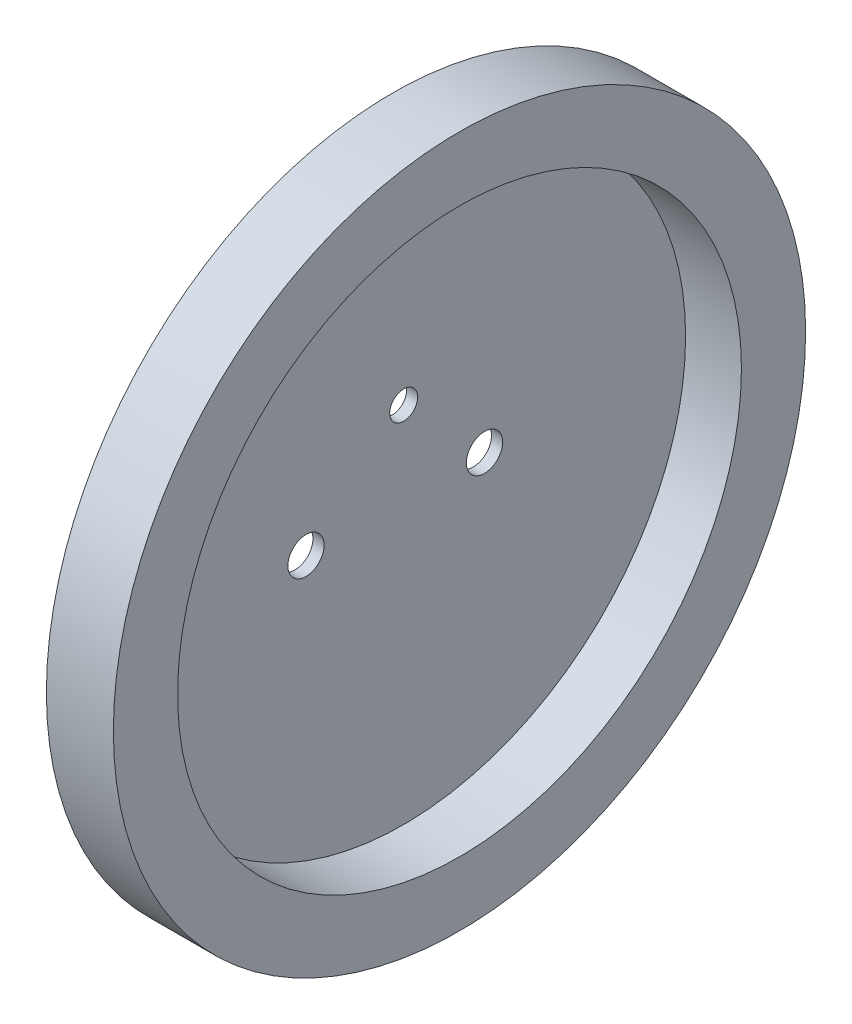
ISO-10303-21;
HEADER;
FILE_DESCRIPTION(('STEP AP214'),'2;1');
FILE_NAME('part.step','',(''),(''),'','','');
FILE_SCHEMA(('AUTOMOTIVE_DESIGN { 1 0 10303 214 1 1 1 1 }'));
ENDSEC;
DATA;
#1=APPLICATION_CONTEXT('core data for automotive mechanical design processes');
#2=APPLICATION_PROTOCOL_DEFINITION('international standard','automotive_design',2000,#1);
#3=PRODUCT_CONTEXT('',#1,'mechanical');
#4=PRODUCT('Part','Part','',(#3));
#5=PRODUCT_RELATED_PRODUCT_CATEGORY('part','',(#4));
#6=PRODUCT_DEFINITION_FORMATION('','',#4);
#7=PRODUCT_DEFINITION_CONTEXT('part definition',#1,'design');
#8=PRODUCT_DEFINITION('design','',#6,#7);
#9=PRODUCT_DEFINITION_SHAPE('','',#8);
#10=(LENGTH_UNIT() NAMED_UNIT(*) SI_UNIT(.MILLI.,.METRE.));
#11=(NAMED_UNIT(*) PLANE_ANGLE_UNIT() SI_UNIT($,.RADIAN.));
#12=(NAMED_UNIT(*) SI_UNIT($,.STERADIAN.) SOLID_ANGLE_UNIT());
#13=UNCERTAINTY_MEASURE_WITH_UNIT(LENGTH_MEASURE(1.E-05),#10,'distance_accuracy_value','');
#14=(GEOMETRIC_REPRESENTATION_CONTEXT(3) GLOBAL_UNCERTAINTY_ASSIGNED_CONTEXT((#13)) GLOBAL_UNIT_ASSIGNED_CONTEXT((#10,
#11,#12)) REPRESENTATION_CONTEXT('',''));
#15=CARTESIAN_POINT('',(0.,0.,0.));
#16=DIRECTION('',(0.,0.,1.));
#17=DIRECTION('',(1.,0.,0.));
#18=AXIS2_PLACEMENT_3D('',#15,#16,#17);
#19=CARTESIAN_POINT('',(12.,0.,0.));
#20=DIRECTION('',(-1.,0.,0.));
#21=DIRECTION('',(0.,0.,1.));
#22=AXIS2_PLACEMENT_3D('',#19,#20,#21);
#23=CYLINDRICAL_SURFACE('',#22,62.);
#24=CARTESIAN_POINT('',(12.,0.,0.));
#25=DIRECTION('',(1.,0.,0.));
#26=DIRECTION('',(0.,0.,-1.));
#27=AXIS2_PLACEMENT_3D('',#24,#25,#26);
#28=CIRCLE('',#27,62.);
#29=CARTESIAN_POINT('',(12.,0.,-62.));
#30=VERTEX_POINT('',#29);
#31=EDGE_CURVE('E10',#30,#30,#28,.T.);
#32=ORIENTED_EDGE('',*,*,#31,.F.);
#33=EDGE_LOOP('',(#32));
#34=FACE_BOUND('',#33,.T.);
#35=CARTESIAN_POINT('',(0.,0.,0.));
#36=DIRECTION('',(1.,0.,0.));
#37=DIRECTION('',(0.,0.,-1.));
#38=AXIS2_PLACEMENT_3D('',#35,#36,#37);
#39=CIRCLE('',#38,62.);
#40=CARTESIAN_POINT('',(0.,0.,-62.));
#41=VERTEX_POINT('',#40);
#42=EDGE_CURVE('E44',#41,#41,#39,.T.);
#43=ORIENTED_EDGE('',*,*,#42,.T.);
#44=EDGE_LOOP('',(#43));
#45=FACE_BOUND('',#44,.T.);
#46=ADVANCED_FACE('F37',(#34,#45),#23,.T.);
#47=CARTESIAN_POINT('',(12.,0.,0.));
#48=DIRECTION('',(1.,0.,0.));
#49=DIRECTION('',(0.,0.,-1.));
#50=AXIS2_PLACEMENT_3D('',#47,#48,#49);
#51=PLANE('',#50);
#52=CARTESIAN_POINT('',(12.,0.,0.));
#53=DIRECTION('',(1.,0.,0.));
#54=DIRECTION('',(0.,0.,-1.));
#55=AXIS2_PLACEMENT_3D('',#52,#53,#54);
#56=CIRCLE('',#55,50.5);
#57=CARTESIAN_POINT('',(12.,0.,-50.5));
#58=VERTEX_POINT('',#57);
#59=EDGE_CURVE('E52',#58,#58,#56,.T.);
#60=ORIENTED_EDGE('',*,*,#59,.F.);
#61=EDGE_LOOP('',(#60));
#62=FACE_BOUND('',#61,.T.);
#63=ORIENTED_EDGE('',*,*,#31,.T.);
#64=EDGE_LOOP('',(#63));
#65=FACE_BOUND('',#64,.T.);
#66=ADVANCED_FACE('F87',(#62,#65),#51,.T.);
#67=CARTESIAN_POINT('',(0.,0.,0.));
#68=DIRECTION('',(1.,0.,0.));
#69=DIRECTION('',(0.,0.,-1.));
#70=AXIS2_PLACEMENT_3D('',#67,#68,#69);
#71=PLANE('',#70);
#72=CARTESIAN_POINT('',(0.,14.5815391960452,0.));
#73=DIRECTION('',(-1.,0.,0.));
#74=DIRECTION('',(0.,0.,1.));
#75=AXIS2_PLACEMENT_3D('',#72,#73,#74);
#76=CIRCLE('',#75,2.5);
#77=CARTESIAN_POINT('',(0.,14.5815391960452,2.5));
#78=VERTEX_POINT('',#77);
#79=EDGE_CURVE('E58',#78,#78,#76,.T.);
#80=ORIENTED_EDGE('',*,*,#79,.F.);
#81=EDGE_LOOP('',(#80));
#82=FACE_BOUND('',#81,.T.);
#83=CARTESIAN_POINT('',(0.,0.,-14.4809768567621));
#84=DIRECTION('',(-1.,0.,0.));
#85=DIRECTION('',(0.,0.,1.));
#86=AXIS2_PLACEMENT_3D('',#83,#84,#85);
#87=CIRCLE('',#86,3.25);
#88=CARTESIAN_POINT('',(0.,0.,-11.2309768567621));
#89=VERTEX_POINT('',#88);
#90=EDGE_CURVE('E75',#89,#89,#87,.T.);
#91=ORIENTED_EDGE('',*,*,#90,.F.);
#92=EDGE_LOOP('',(#91));
#93=FACE_BOUND('',#92,.T.);
#94=CARTESIAN_POINT('',(0.,0.,17.4978470352543));
#95=DIRECTION('',(-1.,0.,0.));
#96=DIRECTION('',(0.,0.,1.));
#97=AXIS2_PLACEMENT_3D('',#94,#95,#96);
#98=CIRCLE('',#97,3.25);
#99=CARTESIAN_POINT('',(0.,0.,20.7478470352543));
#100=VERTEX_POINT('',#99);
#101=EDGE_CURVE('E72',#100,#100,#98,.T.);
#102=ORIENTED_EDGE('',*,*,#101,.F.);
#103=EDGE_LOOP('',(#102));
#104=FACE_BOUND('',#103,.T.);
#105=ORIENTED_EDGE('',*,*,#42,.F.);
#106=EDGE_LOOP('',(#105));
#107=FACE_BOUND('',#106,.T.);
#108=ADVANCED_FACE('F83',(#82,#93,#104,#107),#71,.F.);
#109=CARTESIAN_POINT('',(2.,0.,0.));
#110=DIRECTION('',(1.,0.,0.));
#111=DIRECTION('',(0.,0.,-1.));
#112=AXIS2_PLACEMENT_3D('',#109,#110,#111);
#113=CYLINDRICAL_SURFACE('',#112,50.5);
#114=CARTESIAN_POINT('',(2.,0.,0.));
#115=DIRECTION('',(1.,0.,0.));
#116=DIRECTION('',(0.,0.,-1.));
#117=AXIS2_PLACEMENT_3D('',#114,#115,#116);
#118=CIRCLE('',#117,50.5);
#119=CARTESIAN_POINT('',(2.,0.,-50.5));
#120=VERTEX_POINT('',#119);
#121=EDGE_CURVE('E49',#120,#120,#118,.T.);
#122=ORIENTED_EDGE('',*,*,#121,.F.);
#123=EDGE_LOOP('',(#122));
#124=FACE_BOUND('',#123,.T.);
#125=ORIENTED_EDGE('',*,*,#59,.T.);
#126=EDGE_LOOP('',(#125));
#127=FACE_BOUND('',#126,.T.);
#128=ADVANCED_FACE('F86',(#124,#127),#113,.F.);
#129=CARTESIAN_POINT('',(2.,0.,0.));
#130=DIRECTION('',(1.,0.,0.));
#131=DIRECTION('',(0.,0.,-1.));
#132=AXIS2_PLACEMENT_3D('',#129,#130,#131);
#133=PLANE('',#132);
#134=CARTESIAN_POINT('',(2.,14.5815391960452,0.));
#135=DIRECTION('',(1.,0.,0.));
#136=DIRECTION('',(0.,0.,-1.));
#137=AXIS2_PLACEMENT_3D('',#134,#135,#136);
#138=CIRCLE('',#137,2.5);
#139=CARTESIAN_POINT('',(2.,14.5815391960452,-2.5));
#140=VERTEX_POINT('',#139);
#141=EDGE_CURVE('E40',#140,#140,#138,.T.);
#142=ORIENTED_EDGE('',*,*,#141,.F.);
#143=EDGE_LOOP('',(#142));
#144=FACE_BOUND('',#143,.T.);
#145=CARTESIAN_POINT('',(2.,0.,-14.4809768567621));
#146=DIRECTION('',(1.,0.,0.));
#147=DIRECTION('',(0.,0.,-1.));
#148=AXIS2_PLACEMENT_3D('',#145,#146,#147);
#149=CIRCLE('',#148,3.25);
#150=CARTESIAN_POINT('',(2.,0.,-17.7309768567621));
#151=VERTEX_POINT('',#150);
#152=EDGE_CURVE('E57',#151,#151,#149,.T.);
#153=ORIENTED_EDGE('',*,*,#152,.F.);
#154=EDGE_LOOP('',(#153));
#155=FACE_BOUND('',#154,.T.);
#156=CARTESIAN_POINT('',(2.,0.,17.4978470352543));
#157=DIRECTION('',(1.,0.,0.));
#158=DIRECTION('',(0.,0.,-1.));
#159=AXIS2_PLACEMENT_3D('',#156,#157,#158);
#160=CIRCLE('',#159,3.25);
#161=CARTESIAN_POINT('',(2.,0.,14.2478470352543));
#162=VERTEX_POINT('',#161);
#163=EDGE_CURVE('E55',#162,#162,#160,.T.);
#164=ORIENTED_EDGE('',*,*,#163,.F.);
#165=EDGE_LOOP('',(#164));
#166=FACE_BOUND('',#165,.T.);
#167=ORIENTED_EDGE('',*,*,#121,.T.);
#168=EDGE_LOOP('',(#167));
#169=FACE_BOUND('',#168,.T.);
#170=ADVANCED_FACE('F106',(#144,#155,#166,#169),#133,.T.);
#171=CARTESIAN_POINT('',(5.,0.,17.4978470352543));
#172=DIRECTION('',(-1.,0.,0.));
#173=DIRECTION('',(0.,0.,1.));
#174=AXIS2_PLACEMENT_3D('',#171,#172,#173);
#175=CYLINDRICAL_SURFACE('',#174,3.25);
#176=ORIENTED_EDGE('',*,*,#163,.T.);
#177=EDGE_LOOP('',(#176));
#178=FACE_BOUND('',#177,.T.);
#179=ORIENTED_EDGE('',*,*,#101,.T.);
#180=EDGE_LOOP('',(#179));
#181=FACE_BOUND('',#180,.T.);
#182=ADVANCED_FACE('F110',(#178,#181),#175,.F.);
#183=CARTESIAN_POINT('',(5.,0.,-14.4809768567621));
#184=DIRECTION('',(-1.,0.,0.));
#185=DIRECTION('',(0.,0.,1.));
#186=AXIS2_PLACEMENT_3D('',#183,#184,#185);
#187=CYLINDRICAL_SURFACE('',#186,3.25);
#188=ORIENTED_EDGE('',*,*,#152,.T.);
#189=EDGE_LOOP('',(#188));
#190=FACE_BOUND('',#189,.T.);
#191=ORIENTED_EDGE('',*,*,#90,.T.);
#192=EDGE_LOOP('',(#191));
#193=FACE_BOUND('',#192,.T.);
#194=ADVANCED_FACE('F114',(#190,#193),#187,.F.);
#195=CARTESIAN_POINT('',(5.,14.5815391960452,0.));
#196=DIRECTION('',(-1.,0.,0.));
#197=DIRECTION('',(0.,0.,1.));
#198=AXIS2_PLACEMENT_3D('',#195,#196,#197);
#199=CYLINDRICAL_SURFACE('',#198,2.5);
#200=ORIENTED_EDGE('',*,*,#141,.T.);
#201=EDGE_LOOP('',(#200));
#202=FACE_BOUND('',#201,.T.);
#203=ORIENTED_EDGE('',*,*,#79,.T.);
#204=EDGE_LOOP('',(#203));
#205=FACE_BOUND('',#204,.T.);
#206=ADVANCED_FACE('F81',(#202,#205),#199,.F.);
#207=CLOSED_SHELL('',(#46,#66,#108,#128,#170,#182,#194,#206));
#208=MANIFOLD_SOLID_BREP('B2',#207);
#209=ADVANCED_BREP_SHAPE_REPRESENTATION('',(#18,#208),#14);
#210=SHAPE_DEFINITION_REPRESENTATION(#9,#209);
ENDSEC;
END-ISO-10303-21;
